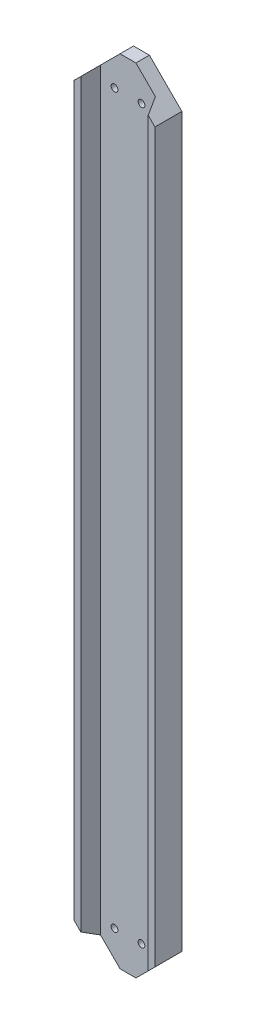
ISO-10303-21;
HEADER;
FILE_DESCRIPTION(('STEP AP214'),'2;1');
FILE_NAME('part.step','',(''),(''),'','','');
FILE_SCHEMA(('AUTOMOTIVE_DESIGN { 1 0 10303 214 1 1 1 1 }'));
ENDSEC;
DATA;
#1=APPLICATION_CONTEXT('core data for automotive mechanical design processes');
#2=APPLICATION_PROTOCOL_DEFINITION('international standard','automotive_design',2000,#1);
#3=PRODUCT_CONTEXT('',#1,'mechanical');
#4=PRODUCT('Part','Part','',(#3));
#5=PRODUCT_RELATED_PRODUCT_CATEGORY('part','',(#4));
#6=PRODUCT_DEFINITION_FORMATION('','',#4);
#7=PRODUCT_DEFINITION_CONTEXT('part definition',#1,'design');
#8=PRODUCT_DEFINITION('design','',#6,#7);
#9=PRODUCT_DEFINITION_SHAPE('','',#8);
#10=(LENGTH_UNIT() NAMED_UNIT(*) SI_UNIT(.MILLI.,.METRE.));
#11=(NAMED_UNIT(*) PLANE_ANGLE_UNIT() SI_UNIT($,.RADIAN.));
#12=(NAMED_UNIT(*) SI_UNIT($,.STERADIAN.) SOLID_ANGLE_UNIT());
#13=UNCERTAINTY_MEASURE_WITH_UNIT(LENGTH_MEASURE(1.E-05),#10,'distance_accuracy_value','');
#14=(GEOMETRIC_REPRESENTATION_CONTEXT(3) GLOBAL_UNCERTAINTY_ASSIGNED_CONTEXT((#13)) GLOBAL_UNIT_ASSIGNED_CONTEXT((#10,
#11,#12)) REPRESENTATION_CONTEXT('',''));
#15=CARTESIAN_POINT('',(0.,0.,0.));
#16=DIRECTION('',(0.,0.,1.));
#17=DIRECTION('',(1.,0.,0.));
#18=AXIS2_PLACEMENT_3D('',#15,#16,#17);
#19=CARTESIAN_POINT('',(0.,2.5,10.));
#20=DIRECTION('',(-0.707106781186547,-0.707106781186548,0.));
#21=DIRECTION('',(0.707106781186548,-0.707106781186547,0.));
#22=AXIS2_PLACEMENT_3D('',#19,#20,#21);
#23=PLANE('',#22);
#24=DIRECTION('',(0.,0.,-1.));
#25=VECTOR('',#24,1.);
#26=CARTESIAN_POINT('',(-12.05,14.55,10.));
#27=LINE('',#26,#25);
#28=CARTESIAN_POINT('',(-12.05,14.55,5.));
#29=VERTEX_POINT('',#28);
#30=CARTESIAN_POINT('',(-12.05,14.55,0.));
#31=VERTEX_POINT('',#30);
#32=EDGE_CURVE('E115',#29,#31,#27,.T.);
#33=ORIENTED_EDGE('',*,*,#32,.F.);
#34=DIRECTION('',(0.707106781186548,-0.707106781186547,0.));
#35=VECTOR('',#34,1.);
#36=CARTESIAN_POINT('',(0.,2.5,5.));
#37=LINE('',#36,#35);
#38=CARTESIAN_POINT('',(-4.83153829077497,7.33153829077496,5.));
#39=VERTEX_POINT('',#38);
#40=EDGE_CURVE('E210',#29,#39,#37,.T.);
#41=ORIENTED_EDGE('',*,*,#40,.T.);
#42=DIRECTION('',(0.389281620635026,-0.389281620635026,0.834817129478987));
#43=VECTOR('',#42,1.);
#44=CARTESIAN_POINT('',(-1.74229909917882,4.24229909917882,11.6248948254873));
#45=LINE('',#44,#43);
#46=CARTESIAN_POINT('',(-2.49999999999997,4.99999999999996,10.));
#47=VERTEX_POINT('',#46);
#48=EDGE_CURVE('E214',#47,#39,#45,.F.);
#49=ORIENTED_EDGE('',*,*,#48,.F.);
#50=DIRECTION('',(-0.707106781186548,0.707106781186547,0.));
#51=VECTOR('',#50,1.);
#52=CARTESIAN_POINT('',(0.,2.5,10.));
#53=LINE('',#52,#51);
#54=CARTESIAN_POINT('',(0.,2.5,10.));
#55=VERTEX_POINT('',#54);
#56=EDGE_CURVE('E113',#55,#47,#53,.T.);
#57=ORIENTED_EDGE('',*,*,#56,.F.);
#58=DIRECTION('',(0.,0.,-1.));
#59=VECTOR('',#58,1.);
#60=CARTESIAN_POINT('',(0.,2.5,10.));
#61=LINE('',#60,#59);
#62=CARTESIAN_POINT('',(0.,2.5,0.));
#63=VERTEX_POINT('',#62);
#64=EDGE_CURVE('E95',#55,#63,#61,.T.);
#65=ORIENTED_EDGE('',*,*,#64,.T.);
#66=DIRECTION('',(-0.707106781186548,0.707106781186547,0.));
#67=VECTOR('',#66,1.);
#68=CARTESIAN_POINT('',(0.,2.5,0.));
#69=LINE('',#68,#67);
#70=EDGE_CURVE('E106',#63,#31,#69,.T.);
#71=ORIENTED_EDGE('',*,*,#70,.T.);
#72=EDGE_LOOP('',(#33,#41,#49,#57,#65,#71));
#73=FACE_BOUND('',#72,.T.);
#74=ADVANCED_FACE('F45',(#73),#23,.F.);
#75=CARTESIAN_POINT('',(-30.,2.5,10.));
#76=DIRECTION('',(-0.707106781186548,0.707106781186548,0.));
#77=DIRECTION('',(-0.707106781186548,-0.707106781186548,0.));
#78=AXIS2_PLACEMENT_3D('',#75,#76,#77);
#79=PLANE('',#78);
#80=DIRECTION('',(-0.707106781186548,-0.707106781186548,0.));
#81=VECTOR('',#80,1.);
#82=CARTESIAN_POINT('',(-30.,2.5,5.));
#83=LINE('',#82,#81);
#84=CARTESIAN_POINT('',(-17.95,14.55,5.));
#85=VERTEX_POINT('',#84);
#86=CARTESIAN_POINT('',(-25.2,7.29999999999999,5.));
#87=VERTEX_POINT('',#86);
#88=EDGE_CURVE('E206',#85,#87,#83,.T.);
#89=ORIENTED_EDGE('',*,*,#88,.F.);
#90=DIRECTION('',(0.,0.,-1.));
#91=VECTOR('',#90,1.);
#92=CARTESIAN_POINT('',(-17.95,14.55,10.));
#93=LINE('',#92,#91);
#94=CARTESIAN_POINT('',(-17.95,14.55,0.));
#95=VERTEX_POINT('',#94);
#96=EDGE_CURVE('E130',#85,#95,#93,.T.);
#97=ORIENTED_EDGE('',*,*,#96,.T.);
#98=DIRECTION('',(0.707106781186547,0.707106781186547,0.));
#99=VECTOR('',#98,1.);
#100=CARTESIAN_POINT('',(-30.,2.5,0.));
#101=LINE('',#100,#99);
#102=CARTESIAN_POINT('',(-30.,2.5,0.));
#103=VERTEX_POINT('',#102);
#104=EDGE_CURVE('E124',#103,#95,#101,.T.);
#105=ORIENTED_EDGE('',*,*,#104,.F.);
#106=DIRECTION('',(0.,0.,-1.));
#107=VECTOR('',#106,1.);
#108=CARTESIAN_POINT('',(-30.,2.5,10.));
#109=LINE('',#108,#107);
#110=CARTESIAN_POINT('',(-30.,2.5,10.));
#111=VERTEX_POINT('',#110);
#112=EDGE_CURVE('E133',#111,#103,#109,.T.);
#113=ORIENTED_EDGE('',*,*,#112,.F.);
#114=DIRECTION('',(0.707106781186547,0.707106781186547,0.));
#115=VECTOR('',#114,1.);
#116=CARTESIAN_POINT('',(-30.,2.5,10.));
#117=LINE('',#116,#115);
#118=CARTESIAN_POINT('',(-27.5,5.00000000000003,10.));
#119=VERTEX_POINT('',#118);
#120=EDGE_CURVE('E254',#111,#119,#117,.T.);
#121=ORIENTED_EDGE('',*,*,#120,.T.);
#122=DIRECTION('',(-0.385589202603884,-0.385589202603884,0.838237396964966));
#123=VECTOR('',#122,1.);
#124=CARTESIAN_POINT('',(-28.2433951658235,4.25660483417649,11.6160764474424));
#125=LINE('',#124,#123);
#126=EDGE_CURVE('E184',#87,#119,#125,.T.);
#127=ORIENTED_EDGE('',*,*,#126,.F.);
#128=EDGE_LOOP('',(#89,#97,#105,#113,#121,#127));
#129=FACE_BOUND('',#128,.T.);
#130=ADVANCED_FACE('F270',(#129),#79,.T.);
#131=CARTESIAN_POINT('',(0.,0.,10.));
#132=DIRECTION('',(0.,0.,1.));
#133=DIRECTION('',(1.,0.,0.));
#134=AXIS2_PLACEMENT_3D('',#131,#132,#133);
#135=PLANE('',#134);
#136=ORIENTED_EDGE('',*,*,#56,.T.);
#137=DIRECTION('',(0.,-1.,0.));
#138=VECTOR('',#137,1.);
#139=CARTESIAN_POINT('',(-2.49999999999997,14.55,10.));
#140=LINE('',#139,#138);
#141=CARTESIAN_POINT('',(-2.49999999999993,-270.,10.));
#142=VERTEX_POINT('',#141);
#143=EDGE_CURVE('E188',#47,#142,#140,.T.);
#144=ORIENTED_EDGE('',*,*,#143,.T.);
#145=DIRECTION('',(-0.707106781186547,-0.707106781186548,0.));
#146=VECTOR('',#145,1.);
#147=CARTESIAN_POINT('',(0.,-267.5,10.));
#148=LINE('',#147,#146);
#149=CARTESIAN_POINT('',(0.,-267.5,10.));
#150=VERTEX_POINT('',#149);
#151=EDGE_CURVE('E219',#150,#142,#148,.T.);
#152=ORIENTED_EDGE('',*,*,#151,.F.);
#153=DIRECTION('',(0.,1.,0.));
#154=VECTOR('',#153,1.);
#155=CARTESIAN_POINT('',(0.,0.,10.));
#156=LINE('',#155,#154);
#157=EDGE_CURVE('E72',#150,#55,#156,.T.);
#158=ORIENTED_EDGE('',*,*,#157,.T.);
#159=EDGE_LOOP('',(#136,#144,#152,#158));
#160=FACE_BOUND('',#159,.T.);
#161=ADVANCED_FACE('F336',(#160),#135,.T.);
#162=CARTESIAN_POINT('',(0.,-267.5,10.));
#163=DIRECTION('',(0.707106781186548,-0.707106781186547,0.));
#164=DIRECTION('',(0.707106781186547,0.707106781186548,0.));
#165=AXIS2_PLACEMENT_3D('',#162,#163,#164);
#166=PLANE('',#165);
#167=ORIENTED_EDGE('',*,*,#151,.T.);
#168=DIRECTION('',(0.389281620635026,0.389281620635026,0.834817129478987));
#169=VECTOR('',#168,1.);
#170=CARTESIAN_POINT('',(-1.74229909917878,-269.242299099179,11.6248948254873));
#171=LINE('',#170,#169);
#172=CARTESIAN_POINT('',(-4.83153829077492,-272.331538290775,5.));
#173=VERTEX_POINT('',#172);
#174=EDGE_CURVE('E11',#142,#173,#171,.F.);
#175=ORIENTED_EDGE('',*,*,#174,.T.);
#176=DIRECTION('',(0.707106781186547,0.707106781186548,0.));
#177=VECTOR('',#176,1.);
#178=CARTESIAN_POINT('',(0.,-267.5,5.));
#179=LINE('',#178,#177);
#180=CARTESIAN_POINT('',(-12.05,-279.55,5.));
#181=VERTEX_POINT('',#180);
#182=EDGE_CURVE('E55',#181,#173,#179,.T.);
#183=ORIENTED_EDGE('',*,*,#182,.F.);
#184=DIRECTION('',(0.,0.,-1.));
#185=VECTOR('',#184,1.);
#186=CARTESIAN_POINT('',(-12.05,-279.55,10.));
#187=LINE('',#186,#185);
#188=CARTESIAN_POINT('',(-12.05,-279.55,0.));
#189=VERTEX_POINT('',#188);
#190=EDGE_CURVE('E228',#181,#189,#187,.T.);
#191=ORIENTED_EDGE('',*,*,#190,.T.);
#192=DIRECTION('',(-0.707106781186547,-0.707106781186548,0.));
#193=VECTOR('',#192,1.);
#194=CARTESIAN_POINT('',(0.,-267.5,0.));
#195=LINE('',#194,#193);
#196=CARTESIAN_POINT('',(0.,-267.5,0.));
#197=VERTEX_POINT('',#196);
#198=EDGE_CURVE('E218',#197,#189,#195,.T.);
#199=ORIENTED_EDGE('',*,*,#198,.F.);
#200=DIRECTION('',(0.,0.,1.));
#201=VECTOR('',#200,1.);
#202=CARTESIAN_POINT('',(0.,-267.5,10.));
#203=LINE('',#202,#201);
#204=EDGE_CURVE('E99',#197,#150,#203,.T.);
#205=ORIENTED_EDGE('',*,*,#204,.T.);
#206=EDGE_LOOP('',(#167,#175,#183,#191,#199,#205));
#207=FACE_BOUND('',#206,.T.);
#208=ADVANCED_FACE('F333',(#207),#166,.T.);
#209=CARTESIAN_POINT('',(-30.,0.,10.));
#210=DIRECTION('',(-1.,0.,0.));
#211=DIRECTION('',(0.,0.,1.));
#212=AXIS2_PLACEMENT_3D('',#209,#210,#211);
#213=PLANE('',#212);
#214=DIRECTION('',(0.,1.,0.));
#215=VECTOR('',#214,1.);
#216=CARTESIAN_POINT('',(-30.,0.,10.));
#217=LINE('',#216,#215);
#218=CARTESIAN_POINT('',(-30.,-267.5,10.));
#219=VERTEX_POINT('',#218);
#220=EDGE_CURVE('E105',#219,#111,#217,.T.);
#221=ORIENTED_EDGE('',*,*,#220,.T.);
#222=ORIENTED_EDGE('',*,*,#112,.T.);
#223=DIRECTION('',(0.,1.,0.));
#224=VECTOR('',#223,1.);
#225=CARTESIAN_POINT('',(-30.,0.,0.));
#226=LINE('',#225,#224);
#227=CARTESIAN_POINT('',(-30.,-267.5,0.));
#228=VERTEX_POINT('',#227);
#229=EDGE_CURVE('E251',#228,#103,#226,.T.);
#230=ORIENTED_EDGE('',*,*,#229,.F.);
#231=DIRECTION('',(0.,0.,-1.));
#232=VECTOR('',#231,1.);
#233=CARTESIAN_POINT('',(-30.,-267.5,10.));
#234=LINE('',#233,#232);
#235=EDGE_CURVE('E242',#219,#228,#234,.T.);
#236=ORIENTED_EDGE('',*,*,#235,.F.);
#237=EDGE_LOOP('',(#221,#222,#230,#236));
#238=FACE_BOUND('',#237,.T.);
#239=ADVANCED_FACE('F47',(#238),#213,.T.);
#240=CARTESIAN_POINT('',(0.,0.,10.));
#241=DIRECTION('',(-1.,0.,0.));
#242=DIRECTION('',(0.,0.,1.));
#243=AXIS2_PLACEMENT_3D('',#240,#241,#242);
#244=PLANE('',#243);
#245=DIRECTION('',(0.,1.,0.));
#246=VECTOR('',#245,1.);
#247=CARTESIAN_POINT('',(0.,0.,0.));
#248=LINE('',#247,#246);
#249=EDGE_CURVE('E92',#197,#63,#248,.T.);
#250=ORIENTED_EDGE('',*,*,#249,.T.);
#251=ORIENTED_EDGE('',*,*,#64,.F.);
#252=ORIENTED_EDGE('',*,*,#157,.F.);
#253=ORIENTED_EDGE('',*,*,#204,.F.);
#254=EDGE_LOOP('',(#250,#251,#252,#253));
#255=FACE_BOUND('',#254,.T.);
#256=ADVANCED_FACE('F94',(#255),#244,.F.);
#257=CARTESIAN_POINT('',(-12.05,14.55,10.));
#258=DIRECTION('',(0.,-1.,0.));
#259=DIRECTION('',(1.,0.,0.));
#260=AXIS2_PLACEMENT_3D('',#257,#258,#259);
#261=PLANE('',#260);
#262=DIRECTION('',(1.,0.,0.));
#263=VECTOR('',#262,1.);
#264=CARTESIAN_POINT('',(-14.35,14.55,5.));
#265=LINE('',#264,#263);
#266=EDGE_CURVE('E147',#85,#29,#265,.T.);
#267=ORIENTED_EDGE('',*,*,#266,.T.);
#268=ORIENTED_EDGE('',*,*,#32,.T.);
#269=DIRECTION('',(-1.,0.,0.));
#270=VECTOR('',#269,1.);
#271=CARTESIAN_POINT('',(-12.05,14.55,0.));
#272=LINE('',#271,#270);
#273=EDGE_CURVE('E120',#31,#95,#272,.T.);
#274=ORIENTED_EDGE('',*,*,#273,.T.);
#275=ORIENTED_EDGE('',*,*,#96,.F.);
#276=EDGE_LOOP('',(#267,#268,#274,#275));
#277=FACE_BOUND('',#276,.T.);
#278=ADVANCED_FACE('F277',(#277),#261,.F.);
#279=DIRECTION('',(0.,-1.,0.));
#280=VECTOR('',#279,1.);
#281=CARTESIAN_POINT('',(-27.5,14.55,10.));
#282=LINE('',#281,#280);
#283=CARTESIAN_POINT('',(-27.4999999999999,-270.,10.));
#284=VERTEX_POINT('',#283);
#285=EDGE_CURVE('E192',#119,#284,#282,.T.);
#286=ORIENTED_EDGE('',*,*,#285,.F.);
#287=ORIENTED_EDGE('',*,*,#120,.F.);
#288=ORIENTED_EDGE('',*,*,#220,.F.);
#289=DIRECTION('',(0.707106781186548,-0.707106781186547,0.));
#290=VECTOR('',#289,1.);
#291=CARTESIAN_POINT('',(-30.,-267.5,10.));
#292=LINE('',#291,#290);
#293=EDGE_CURVE('E223',#219,#284,#292,.T.);
#294=ORIENTED_EDGE('',*,*,#293,.T.);
#295=EDGE_LOOP('',(#286,#287,#288,#294));
#296=FACE_BOUND('',#295,.T.);
#297=ADVANCED_FACE('F316',(#296),#135,.T.);
#298=CARTESIAN_POINT('',(0.,0.,0.));
#299=DIRECTION('',(0.,0.,1.));
#300=DIRECTION('',(1.,0.,0.));
#301=AXIS2_PLACEMENT_3D('',#298,#299,#300);
#302=PLANE('',#301);
#303=CARTESIAN_POINT('',(-9.99999999999993,-267.55,0.));
#304=DIRECTION('',(0.,0.,-1.));
#305=DIRECTION('',(1.,0.,0.));
#306=AXIS2_PLACEMENT_3D('',#303,#304,#305);
#307=CIRCLE('',#306,1.25);
#308=CARTESIAN_POINT('',(-8.74999999999993,-267.55,0.));
#309=VERTEX_POINT('',#308);
#310=EDGE_CURVE('E151',#309,#309,#307,.T.);
#311=ORIENTED_EDGE('',*,*,#310,.F.);
#312=EDGE_LOOP('',(#311));
#313=FACE_BOUND('',#312,.T.);
#314=CARTESIAN_POINT('',(-19.9999999999999,-267.55,0.));
#315=DIRECTION('',(0.,0.,-1.));
#316=DIRECTION('',(1.,0.,0.));
#317=AXIS2_PLACEMENT_3D('',#314,#315,#316);
#318=CIRCLE('',#317,1.25);
#319=CARTESIAN_POINT('',(-18.7499999999999,-267.55,0.));
#320=VERTEX_POINT('',#319);
#321=EDGE_CURVE('E159',#320,#320,#318,.T.);
#322=ORIENTED_EDGE('',*,*,#321,.F.);
#323=EDGE_LOOP('',(#322));
#324=FACE_BOUND('',#323,.T.);
#325=CARTESIAN_POINT('',(-9.99999999999997,2.55,0.));
#326=DIRECTION('',(0.,0.,1.));
#327=DIRECTION('',(1.,0.,0.));
#328=AXIS2_PLACEMENT_3D('',#325,#326,#327);
#329=CIRCLE('',#328,1.25);
#330=CARTESIAN_POINT('',(-8.74999999999996,2.55,0.));
#331=VERTEX_POINT('',#330);
#332=EDGE_CURVE('E144',#331,#331,#329,.T.);
#333=ORIENTED_EDGE('',*,*,#332,.T.);
#334=EDGE_LOOP('',(#333));
#335=FACE_BOUND('',#334,.T.);
#336=CARTESIAN_POINT('',(-20.,2.55,0.));
#337=DIRECTION('',(0.,0.,1.));
#338=DIRECTION('',(1.,0.,0.));
#339=AXIS2_PLACEMENT_3D('',#336,#337,#338);
#340=CIRCLE('',#339,1.25);
#341=CARTESIAN_POINT('',(-18.75,2.55,0.));
#342=VERTEX_POINT('',#341);
#343=EDGE_CURVE('E157',#342,#342,#340,.T.);
#344=ORIENTED_EDGE('',*,*,#343,.T.);
#345=EDGE_LOOP('',(#344));
#346=FACE_BOUND('',#345,.T.);
#347=ORIENTED_EDGE('',*,*,#229,.T.);
#348=ORIENTED_EDGE('',*,*,#104,.T.);
#349=ORIENTED_EDGE('',*,*,#273,.F.);
#350=ORIENTED_EDGE('',*,*,#70,.F.);
#351=ORIENTED_EDGE('',*,*,#249,.F.);
#352=ORIENTED_EDGE('',*,*,#198,.T.);
#353=DIRECTION('',(-1.,0.,0.));
#354=VECTOR('',#353,1.);
#355=CARTESIAN_POINT('',(-12.05,-279.55,0.));
#356=LINE('',#355,#354);
#357=CARTESIAN_POINT('',(-17.95,-279.55,0.));
#358=VERTEX_POINT('',#357);
#359=EDGE_CURVE('E231',#189,#358,#356,.T.);
#360=ORIENTED_EDGE('',*,*,#359,.T.);
#361=DIRECTION('',(0.707106781186548,-0.707106781186547,0.));
#362=VECTOR('',#361,1.);
#363=CARTESIAN_POINT('',(-30.,-267.5,0.));
#364=LINE('',#363,#362);
#365=EDGE_CURVE('E224',#228,#358,#364,.T.);
#366=ORIENTED_EDGE('',*,*,#365,.F.);
#367=EDGE_LOOP('',(#347,#348,#349,#350,#351,#352,#360,#366));
#368=FACE_BOUND('',#367,.T.);
#369=ADVANCED_FACE('F117',(#313,#324,#335,#346,#368),#302,.F.);
#370=CARTESIAN_POINT('',(-30.,-267.5,10.));
#371=DIRECTION('',(0.707106781186547,0.707106781186548,0.));
#372=DIRECTION('',(-0.707106781186548,0.707106781186547,0.));
#373=AXIS2_PLACEMENT_3D('',#370,#371,#372);
#374=PLANE('',#373);
#375=DIRECTION('',(-0.707106781186548,0.707106781186547,0.));
#376=VECTOR('',#375,1.);
#377=CARTESIAN_POINT('',(-30.,-267.5,5.));
#378=LINE('',#377,#376);
#379=CARTESIAN_POINT('',(-17.95,-279.55,5.));
#380=VERTEX_POINT('',#379);
#381=CARTESIAN_POINT('',(-25.2,-272.3,5.));
#382=VERTEX_POINT('',#381);
#383=EDGE_CURVE('E202',#380,#382,#378,.T.);
#384=ORIENTED_EDGE('',*,*,#383,.T.);
#385=DIRECTION('',(-0.385589202603884,0.385589202603884,0.838237396964966));
#386=VECTOR('',#385,1.);
#387=CARTESIAN_POINT('',(-28.2433951658234,-269.256604834177,11.6160764474424));
#388=LINE('',#387,#386);
#389=EDGE_CURVE('E180',#382,#284,#388,.T.);
#390=ORIENTED_EDGE('',*,*,#389,.T.);
#391=ORIENTED_EDGE('',*,*,#293,.F.);
#392=ORIENTED_EDGE('',*,*,#235,.T.);
#393=ORIENTED_EDGE('',*,*,#365,.T.);
#394=DIRECTION('',(0.,0.,-1.));
#395=VECTOR('',#394,1.);
#396=CARTESIAN_POINT('',(-17.95,-279.55,10.));
#397=LINE('',#396,#395);
#398=EDGE_CURVE('E238',#380,#358,#397,.T.);
#399=ORIENTED_EDGE('',*,*,#398,.F.);
#400=EDGE_LOOP('',(#384,#390,#391,#392,#393,#399));
#401=FACE_BOUND('',#400,.T.);
#402=ADVANCED_FACE('F320',(#401),#374,.F.);
#403=CARTESIAN_POINT('',(-12.05,-279.55,10.));
#404=DIRECTION('',(0.,-1.,0.));
#405=DIRECTION('',(1.,0.,0.));
#406=AXIS2_PLACEMENT_3D('',#403,#404,#405);
#407=PLANE('',#406);
#408=DIRECTION('',(1.,0.,0.));
#409=VECTOR('',#408,1.);
#410=CARTESIAN_POINT('',(-12.05,-279.55,5.));
#411=LINE('',#410,#409);
#412=EDGE_CURVE('E63',#380,#181,#411,.T.);
#413=ORIENTED_EDGE('',*,*,#412,.F.);
#414=ORIENTED_EDGE('',*,*,#398,.T.);
#415=ORIENTED_EDGE('',*,*,#359,.F.);
#416=ORIENTED_EDGE('',*,*,#190,.F.);
#417=EDGE_LOOP('',(#413,#414,#415,#416));
#418=FACE_BOUND('',#417,.T.);
#419=ADVANCED_FACE('F330',(#418),#407,.T.);
#420=CARTESIAN_POINT('',(-2.49999999999997,14.55,10.));
#421=DIRECTION('',(0.90630778703665,0.,-0.4226182617407));
#422=DIRECTION('',(-0.4226182617407,0.,-0.90630778703665));
#423=AXIS2_PLACEMENT_3D('',#420,#421,#422);
#424=PLANE('',#423);
#425=ORIENTED_EDGE('',*,*,#48,.T.);
#426=DIRECTION('',(0.,1.,0.));
#427=VECTOR('',#426,1.);
#428=CARTESIAN_POINT('',(-4.83153829077497,14.55,5.));
#429=LINE('',#428,#427);
#430=EDGE_CURVE('E196',#39,#173,#429,.F.);
#431=ORIENTED_EDGE('',*,*,#430,.T.);
#432=ORIENTED_EDGE('',*,*,#174,.F.);
#433=ORIENTED_EDGE('',*,*,#143,.F.);
#434=EDGE_LOOP('',(#425,#431,#432,#433));
#435=FACE_BOUND('',#434,.T.);
#436=ADVANCED_FACE('F335',(#435),#424,.F.);
#437=CARTESIAN_POINT('',(0.,0.,5.));
#438=DIRECTION('',(0.,0.,-1.));
#439=DIRECTION('',(-1.,0.,0.));
#440=AXIS2_PLACEMENT_3D('',#437,#438,#439);
#441=PLANE('',#440);
#442=ORIENTED_EDGE('',*,*,#40,.F.);
#443=ORIENTED_EDGE('',*,*,#266,.F.);
#444=ORIENTED_EDGE('',*,*,#88,.T.);
#445=DIRECTION('',(0.,-1.,0.));
#446=VECTOR('',#445,1.);
#447=CARTESIAN_POINT('',(-25.2,14.55,5.));
#448=LINE('',#447,#446);
#449=EDGE_CURVE('E176',#87,#382,#448,.T.);
#450=ORIENTED_EDGE('',*,*,#449,.T.);
#451=ORIENTED_EDGE('',*,*,#383,.F.);
#452=ORIENTED_EDGE('',*,*,#412,.T.);
#453=ORIENTED_EDGE('',*,*,#182,.T.);
#454=ORIENTED_EDGE('',*,*,#430,.F.);
#455=EDGE_LOOP('',(#442,#443,#444,#450,#451,#452,#453,#454));
#456=FACE_BOUND('',#455,.T.);
#457=CARTESIAN_POINT('',(-9.99999999999993,-267.55,5.));
#458=DIRECTION('',(0.,0.,-1.));
#459=DIRECTION('',(-1.,0.,0.));
#460=AXIS2_PLACEMENT_3D('',#457,#458,#459);
#461=CIRCLE('',#460,1.25);
#462=CARTESIAN_POINT('',(-11.2499999999999,-267.55,5.));
#463=VERTEX_POINT('',#462);
#464=EDGE_CURVE('E49',#463,#463,#461,.F.);
#465=ORIENTED_EDGE('',*,*,#464,.F.);
#466=EDGE_LOOP('',(#465));
#467=FACE_BOUND('',#466,.T.);
#468=CARTESIAN_POINT('',(-19.9999999999999,-267.55,5.));
#469=DIRECTION('',(0.,0.,-1.));
#470=DIRECTION('',(-1.,0.,0.));
#471=AXIS2_PLACEMENT_3D('',#468,#469,#470);
#472=CIRCLE('',#471,1.25);
#473=CARTESIAN_POINT('',(-21.2499999999999,-267.55,5.));
#474=VERTEX_POINT('',#473);
#475=EDGE_CURVE('E148',#474,#474,#472,.F.);
#476=ORIENTED_EDGE('',*,*,#475,.F.);
#477=EDGE_LOOP('',(#476));
#478=FACE_BOUND('',#477,.T.);
#479=CARTESIAN_POINT('',(-9.99999999999997,2.55,5.));
#480=DIRECTION('',(0.,0.,-1.));
#481=DIRECTION('',(-1.,0.,0.));
#482=AXIS2_PLACEMENT_3D('',#479,#480,#481);
#483=CIRCLE('',#482,1.25);
#484=CARTESIAN_POINT('',(-11.25,2.55,5.));
#485=VERTEX_POINT('',#484);
#486=EDGE_CURVE('E143',#485,#485,#483,.T.);
#487=ORIENTED_EDGE('',*,*,#486,.T.);
#488=EDGE_LOOP('',(#487));
#489=FACE_BOUND('',#488,.T.);
#490=CARTESIAN_POINT('',(-20.,2.55,5.));
#491=DIRECTION('',(0.,0.,-1.));
#492=DIRECTION('',(-1.,0.,0.));
#493=AXIS2_PLACEMENT_3D('',#490,#491,#492);
#494=CIRCLE('',#493,1.25);
#495=CARTESIAN_POINT('',(-21.25,2.55,5.));
#496=VERTEX_POINT('',#495);
#497=EDGE_CURVE('E139',#496,#496,#494,.T.);
#498=ORIENTED_EDGE('',*,*,#497,.T.);
#499=EDGE_LOOP('',(#498));
#500=FACE_BOUND('',#499,.T.);
#501=ADVANCED_FACE('F326',(#456,#467,#478,#489,#500),#441,.F.);
#502=CARTESIAN_POINT('',(-25.2,14.55,5.));
#503=DIRECTION('',(-0.908490452678575,0.,-0.417905608232144));
#504=DIRECTION('',(-0.417905608232144,0.,0.908490452678575));
#505=AXIS2_PLACEMENT_3D('',#502,#503,#504);
#506=PLANE('',#505);
#507=ORIENTED_EDGE('',*,*,#126,.T.);
#508=ORIENTED_EDGE('',*,*,#285,.T.);
#509=ORIENTED_EDGE('',*,*,#389,.F.);
#510=ORIENTED_EDGE('',*,*,#449,.F.);
#511=EDGE_LOOP('',(#507,#508,#509,#510));
#512=FACE_BOUND('',#511,.T.);
#513=ADVANCED_FACE('F325',(#512),#506,.F.);
#514=CARTESIAN_POINT('',(-20.,2.55,0.));
#515=DIRECTION('',(0.,0.,1.));
#516=DIRECTION('',(1.,0.,0.));
#517=AXIS2_PLACEMENT_3D('',#514,#515,#516);
#518=CYLINDRICAL_SURFACE('',#517,1.25);
#519=ORIENTED_EDGE('',*,*,#343,.F.);
#520=EDGE_LOOP('',(#519));
#521=FACE_BOUND('',#520,.T.);
#522=ORIENTED_EDGE('',*,*,#497,.F.);
#523=EDGE_LOOP('',(#522));
#524=FACE_BOUND('',#523,.T.);
#525=ADVANCED_FACE('F424',(#521,#524),#518,.F.);
#526=CARTESIAN_POINT('',(-9.99999999999997,2.55,0.));
#527=DIRECTION('',(0.,0.,1.));
#528=DIRECTION('',(1.,0.,0.));
#529=AXIS2_PLACEMENT_3D('',#526,#527,#528);
#530=CYLINDRICAL_SURFACE('',#529,1.25);
#531=ORIENTED_EDGE('',*,*,#332,.F.);
#532=EDGE_LOOP('',(#531));
#533=FACE_BOUND('',#532,.T.);
#534=ORIENTED_EDGE('',*,*,#486,.F.);
#535=EDGE_LOOP('',(#534));
#536=FACE_BOUND('',#535,.T.);
#537=ADVANCED_FACE('F435',(#533,#536),#530,.F.);
#538=CARTESIAN_POINT('',(-19.9999999999999,-267.55,0.));
#539=DIRECTION('',(0.,0.,1.));
#540=DIRECTION('',(1.,0.,0.));
#541=AXIS2_PLACEMENT_3D('',#538,#539,#540);
#542=CYLINDRICAL_SURFACE('',#541,1.25);
#543=ORIENTED_EDGE('',*,*,#321,.T.);
#544=EDGE_LOOP('',(#543));
#545=FACE_BOUND('',#544,.T.);
#546=ORIENTED_EDGE('',*,*,#475,.T.);
#547=EDGE_LOOP('',(#546));
#548=FACE_BOUND('',#547,.T.);
#549=ADVANCED_FACE('F446',(#545,#548),#542,.F.);
#550=CARTESIAN_POINT('',(-9.99999999999993,-267.55,0.));
#551=DIRECTION('',(0.,0.,1.));
#552=DIRECTION('',(1.,0.,0.));
#553=AXIS2_PLACEMENT_3D('',#550,#551,#552);
#554=CYLINDRICAL_SURFACE('',#553,1.25);
#555=ORIENTED_EDGE('',*,*,#310,.T.);
#556=EDGE_LOOP('',(#555));
#557=FACE_BOUND('',#556,.T.);
#558=ORIENTED_EDGE('',*,*,#464,.T.);
#559=EDGE_LOOP('',(#558));
#560=FACE_BOUND('',#559,.T.);
#561=ADVANCED_FACE('F463',(#557,#560),#554,.F.);
#562=CLOSED_SHELL('',(#74,#130,#161,#208,#239,#256,#278,#297,#369,#402,#419,#436,#501,#513,#525,
#537,#549,#561));
#563=MANIFOLD_SOLID_BREP('B2',#562);
#564=ADVANCED_BREP_SHAPE_REPRESENTATION('',(#18,#563),#14);
#565=SHAPE_DEFINITION_REPRESENTATION(#9,#564);
ENDSEC;
END-ISO-10303-21;
